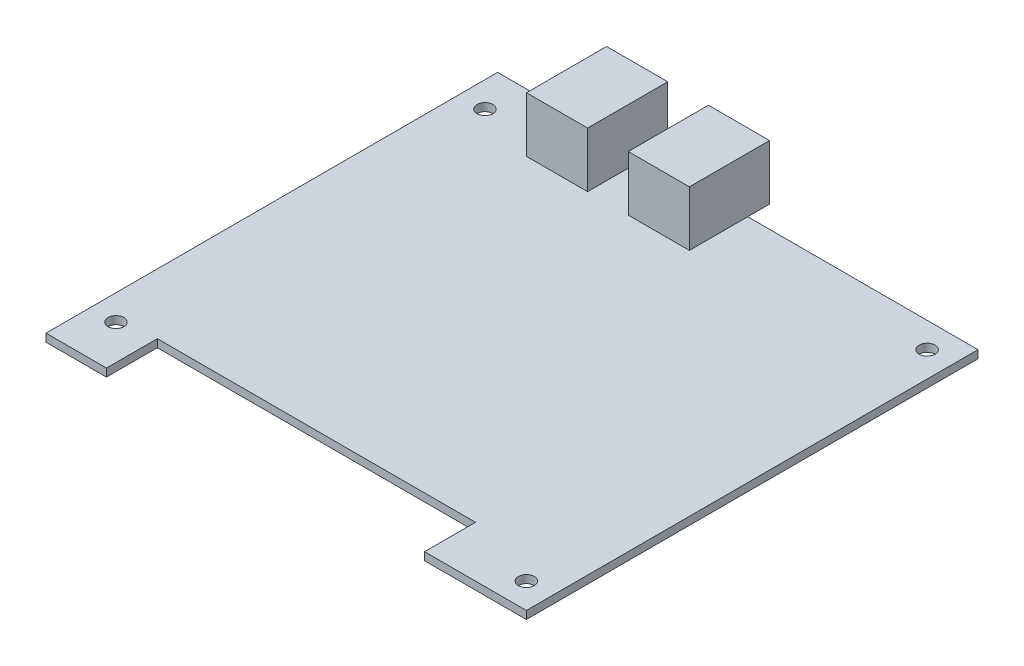
ISO-10303-21;
HEADER;
FILE_DESCRIPTION(('STEP AP214'),'2;1');
FILE_NAME('part.step','',(''),(''),'','','');
FILE_SCHEMA(('AUTOMOTIVE_DESIGN { 1 0 10303 214 1 1 1 1 }'));
ENDSEC;
DATA;
#1=APPLICATION_CONTEXT('core data for automotive mechanical design processes');
#2=APPLICATION_PROTOCOL_DEFINITION('international standard','automotive_design',2000,#1);
#3=PRODUCT_CONTEXT('',#1,'mechanical');
#4=PRODUCT('Part','Part','',(#3));
#5=PRODUCT_RELATED_PRODUCT_CATEGORY('part','',(#4));
#6=PRODUCT_DEFINITION_FORMATION('','',#4);
#7=PRODUCT_DEFINITION_CONTEXT('part definition',#1,'design');
#8=PRODUCT_DEFINITION('design','',#6,#7);
#9=PRODUCT_DEFINITION_SHAPE('','',#8);
#10=(LENGTH_UNIT() NAMED_UNIT(*) SI_UNIT(.MILLI.,.METRE.));
#11=(NAMED_UNIT(*) PLANE_ANGLE_UNIT() SI_UNIT($,.RADIAN.));
#12=(NAMED_UNIT(*) SI_UNIT($,.STERADIAN.) SOLID_ANGLE_UNIT());
#13=UNCERTAINTY_MEASURE_WITH_UNIT(LENGTH_MEASURE(1.E-05),#10,'distance_accuracy_value','');
#14=(GEOMETRIC_REPRESENTATION_CONTEXT(3) GLOBAL_UNCERTAINTY_ASSIGNED_CONTEXT((#13)) GLOBAL_UNIT_ASSIGNED_CONTEXT((#10,
#11,#12)) REPRESENTATION_CONTEXT('',''));
#15=CARTESIAN_POINT('',(0.,0.,0.));
#16=DIRECTION('',(0.,0.,1.));
#17=DIRECTION('',(1.,0.,0.));
#18=AXIS2_PLACEMENT_3D('',#15,#16,#17);
#19=CARTESIAN_POINT('',(-10.225,12.57,-49.435));
#20=DIRECTION('',(1.,0.,0.));
#21=DIRECTION('',(0.,0.,-1.));
#22=AXIS2_PLACEMENT_3D('',#19,#20,#21);
#23=PLANE('',#22);
#24=DIRECTION('',(0.,0.,1.));
#25=VECTOR('',#24,1.);
#26=CARTESIAN_POINT('',(-10.225,1.57,-49.435));
#27=LINE('',#26,#25);
#28=CARTESIAN_POINT('',(-10.225,1.57,-49.435));
#29=VERTEX_POINT('',#28);
#30=CARTESIAN_POINT('',(-10.225,1.57,-33.435));
#31=VERTEX_POINT('',#30);
#32=EDGE_CURVE('E106',#29,#31,#27,.T.);
#33=ORIENTED_EDGE('',*,*,#32,.T.);
#34=DIRECTION('',(0.,-1.,0.));
#35=VECTOR('',#34,1.);
#36=CARTESIAN_POINT('',(-10.225,12.57,-33.435));
#37=LINE('',#36,#35);
#38=CARTESIAN_POINT('',(-10.225,12.57,-33.435));
#39=VERTEX_POINT('',#38);
#40=EDGE_CURVE('E12',#39,#31,#37,.T.);
#41=ORIENTED_EDGE('',*,*,#40,.F.);
#42=DIRECTION('',(0.,0.,1.));
#43=VECTOR('',#42,1.);
#44=CARTESIAN_POINT('',(-10.225,12.57,-49.435));
#45=LINE('',#44,#43);
#46=CARTESIAN_POINT('',(-10.225,12.57,-49.435));
#47=VERTEX_POINT('',#46);
#48=EDGE_CURVE('E94',#47,#39,#45,.T.);
#49=ORIENTED_EDGE('',*,*,#48,.F.);
#50=DIRECTION('',(0.,-1.,0.));
#51=VECTOR('',#50,1.);
#52=CARTESIAN_POINT('',(-10.225,12.57,-49.435));
#53=LINE('',#52,#51);
#54=EDGE_CURVE('E102',#47,#29,#53,.T.);
#55=ORIENTED_EDGE('',*,*,#54,.T.);
#56=EDGE_LOOP('',(#33,#41,#49,#55));
#57=FACE_BOUND('',#56,.T.);
#58=ADVANCED_FACE('F43',(#57),#23,.F.);
#59=CARTESIAN_POINT('',(-10.225,12.57,-33.435));
#60=DIRECTION('',(0.,0.,-1.));
#61=DIRECTION('',(-1.,0.,0.));
#62=AXIS2_PLACEMENT_3D('',#59,#60,#61);
#63=PLANE('',#62);
#64=DIRECTION('',(1.,0.,0.));
#65=VECTOR('',#64,1.);
#66=CARTESIAN_POINT('',(-10.225,1.57,-33.435));
#67=LINE('',#66,#65);
#68=CARTESIAN_POINT('',(1.975,1.57,-33.435));
#69=VERTEX_POINT('',#68);
#70=EDGE_CURVE('E98',#31,#69,#67,.T.);
#71=ORIENTED_EDGE('',*,*,#70,.T.);
#72=DIRECTION('',(0.,-1.,0.));
#73=VECTOR('',#72,1.);
#74=CARTESIAN_POINT('',(1.975,12.57,-33.435));
#75=LINE('',#74,#73);
#76=CARTESIAN_POINT('',(1.975,12.57,-33.435));
#77=VERTEX_POINT('',#76);
#78=EDGE_CURVE('E51',#77,#69,#75,.T.);
#79=ORIENTED_EDGE('',*,*,#78,.F.);
#80=DIRECTION('',(1.,0.,0.));
#81=VECTOR('',#80,1.);
#82=CARTESIAN_POINT('',(-10.225,12.57,-33.435));
#83=LINE('',#82,#81);
#84=EDGE_CURVE('E89',#39,#77,#83,.T.);
#85=ORIENTED_EDGE('',*,*,#84,.F.);
#86=ORIENTED_EDGE('',*,*,#40,.T.);
#87=EDGE_LOOP('',(#71,#79,#85,#86));
#88=FACE_BOUND('',#87,.T.);
#89=ADVANCED_FACE('F97',(#88),#63,.F.);
#90=CARTESIAN_POINT('',(1.97499999999999,12.57,-49.435));
#91=DIRECTION('',(-1.,0.,0.));
#92=DIRECTION('',(0.,0.,1.));
#93=AXIS2_PLACEMENT_3D('',#90,#91,#92);
#94=PLANE('',#93);
#95=DIRECTION('',(0.,0.,-1.));
#96=VECTOR('',#95,1.);
#97=CARTESIAN_POINT('',(1.97499999999999,1.57,-49.435));
#98=LINE('',#97,#96);
#99=CARTESIAN_POINT('',(1.97499999999999,1.57,-49.435));
#100=VERTEX_POINT('',#99);
#101=EDGE_CURVE('E76',#69,#100,#98,.T.);
#102=ORIENTED_EDGE('',*,*,#101,.T.);
#103=DIRECTION('',(0.,-1.,0.));
#104=VECTOR('',#103,1.);
#105=CARTESIAN_POINT('',(1.97499999999999,12.57,-49.435));
#106=LINE('',#105,#104);
#107=CARTESIAN_POINT('',(1.97499999999999,12.57,-49.435));
#108=VERTEX_POINT('',#107);
#109=EDGE_CURVE('E99',#108,#100,#106,.T.);
#110=ORIENTED_EDGE('',*,*,#109,.F.);
#111=DIRECTION('',(0.,0.,-1.));
#112=VECTOR('',#111,1.);
#113=CARTESIAN_POINT('',(1.97499999999999,12.57,-49.435));
#114=LINE('',#113,#112);
#115=EDGE_CURVE('E92',#77,#108,#114,.T.);
#116=ORIENTED_EDGE('',*,*,#115,.F.);
#117=ORIENTED_EDGE('',*,*,#78,.T.);
#118=EDGE_LOOP('',(#102,#110,#116,#117));
#119=FACE_BOUND('',#118,.T.);
#120=ADVANCED_FACE('F100',(#119),#94,.F.);
#121=CARTESIAN_POINT('',(-10.225,12.57,-49.435));
#122=DIRECTION('',(0.,0.,1.));
#123=DIRECTION('',(1.,0.,0.));
#124=AXIS2_PLACEMENT_3D('',#121,#122,#123);
#125=PLANE('',#124);
#126=DIRECTION('',(-1.,0.,0.));
#127=VECTOR('',#126,1.);
#128=CARTESIAN_POINT('',(-10.225,1.57,-49.435));
#129=LINE('',#128,#127);
#130=EDGE_CURVE('E82',#100,#29,#129,.T.);
#131=ORIENTED_EDGE('',*,*,#130,.T.);
#132=ORIENTED_EDGE('',*,*,#54,.F.);
#133=DIRECTION('',(-1.,0.,0.));
#134=VECTOR('',#133,1.);
#135=CARTESIAN_POINT('',(-10.225,12.57,-49.435));
#136=LINE('',#135,#134);
#137=EDGE_CURVE('E59',#108,#47,#136,.T.);
#138=ORIENTED_EDGE('',*,*,#137,.F.);
#139=ORIENTED_EDGE('',*,*,#109,.T.);
#140=EDGE_LOOP('',(#131,#132,#138,#139));
#141=FACE_BOUND('',#140,.T.);
#142=ADVANCED_FACE('F113',(#141),#125,.F.);
#143=CARTESIAN_POINT('',(0.,12.57,0.));
#144=DIRECTION('',(0.,1.,0.));
#145=DIRECTION('',(0.,0.,1.));
#146=AXIS2_PLACEMENT_3D('',#143,#144,#145);
#147=PLANE('',#146);
#148=ORIENTED_EDGE('',*,*,#48,.T.);
#149=ORIENTED_EDGE('',*,*,#84,.T.);
#150=ORIENTED_EDGE('',*,*,#115,.T.);
#151=ORIENTED_EDGE('',*,*,#137,.T.);
#152=EDGE_LOOP('',(#148,#149,#150,#151));
#153=FACE_BOUND('',#152,.T.);
#154=ADVANCED_FACE('F90',(#153),#147,.T.);
#155=CARTESIAN_POINT('',(0.,1.57,0.));
#156=DIRECTION('',(0.,1.,0.));
#157=DIRECTION('',(0.,0.,1.));
#158=AXIS2_PLACEMENT_3D('',#155,#156,#157);
#159=PLANE('',#158);
#160=ORIENTED_EDGE('',*,*,#32,.F.);
#161=ORIENTED_EDGE('',*,*,#130,.F.);
#162=ORIENTED_EDGE('',*,*,#101,.F.);
#163=ORIENTED_EDGE('',*,*,#70,.F.);
#164=EDGE_LOOP('',(#160,#161,#162,#163));
#165=FACE_BOUND('',#164,.T.);
#166=ADVANCED_FACE('F116',(#165),#159,.F.);
#167=CLOSED_SHELL('',(#58,#89,#120,#142,#154,#166));
#168=MANIFOLD_SOLID_BREP('B2',#167);
#169=CARTESIAN_POINT('',(-30.545,12.57,-49.435));
#170=DIRECTION('',(1.,0.,0.));
#171=DIRECTION('',(0.,0.,-1.));
#172=AXIS2_PLACEMENT_3D('',#169,#170,#171);
#173=PLANE('',#172);
#174=DIRECTION('',(0.,0.,1.));
#175=VECTOR('',#174,1.);
#176=CARTESIAN_POINT('',(-30.545,1.57,-49.435));
#177=LINE('',#176,#175);
#178=CARTESIAN_POINT('',(-30.545,1.57,-49.435));
#179=VERTEX_POINT('',#178);
#180=CARTESIAN_POINT('',(-30.545,1.57,-33.435));
#181=VERTEX_POINT('',#180);
#182=EDGE_CURVE('E238',#179,#181,#177,.T.);
#183=ORIENTED_EDGE('',*,*,#182,.T.);
#184=DIRECTION('',(0.,-1.,0.));
#185=VECTOR('',#184,1.);
#186=CARTESIAN_POINT('',(-30.545,12.57,-33.435));
#187=LINE('',#186,#185);
#188=CARTESIAN_POINT('',(-30.545,12.57,-33.435));
#189=VERTEX_POINT('',#188);
#190=EDGE_CURVE('E41',#189,#181,#187,.T.);
#191=ORIENTED_EDGE('',*,*,#190,.F.);
#192=DIRECTION('',(0.,0.,1.));
#193=VECTOR('',#192,1.);
#194=CARTESIAN_POINT('',(-30.545,12.57,-49.435));
#195=LINE('',#194,#193);
#196=CARTESIAN_POINT('',(-30.545,12.57,-49.435));
#197=VERTEX_POINT('',#196);
#198=EDGE_CURVE('E226',#197,#189,#195,.T.);
#199=ORIENTED_EDGE('',*,*,#198,.F.);
#200=DIRECTION('',(0.,-1.,0.));
#201=VECTOR('',#200,1.);
#202=CARTESIAN_POINT('',(-30.545,12.57,-49.435));
#203=LINE('',#202,#201);
#204=EDGE_CURVE('E234',#197,#179,#203,.T.);
#205=ORIENTED_EDGE('',*,*,#204,.T.);
#206=EDGE_LOOP('',(#183,#191,#199,#205));
#207=FACE_BOUND('',#206,.T.);
#208=ADVANCED_FACE('F175',(#207),#173,.F.);
#209=CARTESIAN_POINT('',(-30.545,12.57,-33.435));
#210=DIRECTION('',(0.,0.,-1.));
#211=DIRECTION('',(-1.,0.,0.));
#212=AXIS2_PLACEMENT_3D('',#209,#210,#211);
#213=PLANE('',#212);
#214=DIRECTION('',(1.,0.,0.));
#215=VECTOR('',#214,1.);
#216=CARTESIAN_POINT('',(-30.545,1.57,-33.435));
#217=LINE('',#216,#215);
#218=CARTESIAN_POINT('',(-18.345,1.57,-33.435));
#219=VERTEX_POINT('',#218);
#220=EDGE_CURVE('E230',#181,#219,#217,.T.);
#221=ORIENTED_EDGE('',*,*,#220,.T.);
#222=DIRECTION('',(0.,-1.,0.));
#223=VECTOR('',#222,1.);
#224=CARTESIAN_POINT('',(-18.345,12.57,-33.435));
#225=LINE('',#224,#223);
#226=CARTESIAN_POINT('',(-18.345,12.57,-33.435));
#227=VERTEX_POINT('',#226);
#228=EDGE_CURVE('E183',#227,#219,#225,.T.);
#229=ORIENTED_EDGE('',*,*,#228,.F.);
#230=DIRECTION('',(1.,0.,0.));
#231=VECTOR('',#230,1.);
#232=CARTESIAN_POINT('',(-30.545,12.57,-33.435));
#233=LINE('',#232,#231);
#234=EDGE_CURVE('E221',#189,#227,#233,.T.);
#235=ORIENTED_EDGE('',*,*,#234,.F.);
#236=ORIENTED_EDGE('',*,*,#190,.T.);
#237=EDGE_LOOP('',(#221,#229,#235,#236));
#238=FACE_BOUND('',#237,.T.);
#239=ADVANCED_FACE('F229',(#238),#213,.F.);
#240=CARTESIAN_POINT('',(-18.345,12.57,-49.435));
#241=DIRECTION('',(-1.,0.,0.));
#242=DIRECTION('',(0.,0.,1.));
#243=AXIS2_PLACEMENT_3D('',#240,#241,#242);
#244=PLANE('',#243);
#245=DIRECTION('',(0.,0.,-1.));
#246=VECTOR('',#245,1.);
#247=CARTESIAN_POINT('',(-18.345,1.57,-49.435));
#248=LINE('',#247,#246);
#249=CARTESIAN_POINT('',(-18.345,1.57,-49.435));
#250=VERTEX_POINT('',#249);
#251=EDGE_CURVE('E208',#219,#250,#248,.T.);
#252=ORIENTED_EDGE('',*,*,#251,.T.);
#253=DIRECTION('',(0.,-1.,0.));
#254=VECTOR('',#253,1.);
#255=CARTESIAN_POINT('',(-18.345,12.57,-49.435));
#256=LINE('',#255,#254);
#257=CARTESIAN_POINT('',(-18.345,12.57,-49.435));
#258=VERTEX_POINT('',#257);
#259=EDGE_CURVE('E231',#258,#250,#256,.T.);
#260=ORIENTED_EDGE('',*,*,#259,.F.);
#261=DIRECTION('',(0.,0.,-1.));
#262=VECTOR('',#261,1.);
#263=CARTESIAN_POINT('',(-18.345,12.57,-49.435));
#264=LINE('',#263,#262);
#265=EDGE_CURVE('E224',#227,#258,#264,.T.);
#266=ORIENTED_EDGE('',*,*,#265,.F.);
#267=ORIENTED_EDGE('',*,*,#228,.T.);
#268=EDGE_LOOP('',(#252,#260,#266,#267));
#269=FACE_BOUND('',#268,.T.);
#270=ADVANCED_FACE('F232',(#269),#244,.F.);
#271=CARTESIAN_POINT('',(-30.545,12.57,-49.435));
#272=DIRECTION('',(0.,0.,1.));
#273=DIRECTION('',(1.,0.,0.));
#274=AXIS2_PLACEMENT_3D('',#271,#272,#273);
#275=PLANE('',#274);
#276=DIRECTION('',(-1.,0.,0.));
#277=VECTOR('',#276,1.);
#278=CARTESIAN_POINT('',(-30.545,1.57,-49.435));
#279=LINE('',#278,#277);
#280=EDGE_CURVE('E214',#250,#179,#279,.T.);
#281=ORIENTED_EDGE('',*,*,#280,.T.);
#282=ORIENTED_EDGE('',*,*,#204,.F.);
#283=DIRECTION('',(-1.,0.,0.));
#284=VECTOR('',#283,1.);
#285=CARTESIAN_POINT('',(-30.545,12.57,-49.435));
#286=LINE('',#285,#284);
#287=EDGE_CURVE('E191',#258,#197,#286,.T.);
#288=ORIENTED_EDGE('',*,*,#287,.F.);
#289=ORIENTED_EDGE('',*,*,#259,.T.);
#290=EDGE_LOOP('',(#281,#282,#288,#289));
#291=FACE_BOUND('',#290,.T.);
#292=ADVANCED_FACE('F245',(#291),#275,.F.);
#293=CARTESIAN_POINT('',(0.,12.57,0.));
#294=DIRECTION('',(0.,1.,0.));
#295=DIRECTION('',(0.,0.,1.));
#296=AXIS2_PLACEMENT_3D('',#293,#294,#295);
#297=PLANE('',#296);
#298=ORIENTED_EDGE('',*,*,#198,.T.);
#299=ORIENTED_EDGE('',*,*,#234,.T.);
#300=ORIENTED_EDGE('',*,*,#265,.T.);
#301=ORIENTED_EDGE('',*,*,#287,.T.);
#302=EDGE_LOOP('',(#298,#299,#300,#301));
#303=FACE_BOUND('',#302,.T.);
#304=ADVANCED_FACE('F222',(#303),#297,.T.);
#305=CARTESIAN_POINT('',(0.,1.57,0.));
#306=DIRECTION('',(0.,1.,0.));
#307=DIRECTION('',(0.,0.,1.));
#308=AXIS2_PLACEMENT_3D('',#305,#306,#307);
#309=PLANE('',#308);
#310=ORIENTED_EDGE('',*,*,#182,.F.);
#311=ORIENTED_EDGE('',*,*,#280,.F.);
#312=ORIENTED_EDGE('',*,*,#251,.F.);
#313=ORIENTED_EDGE('',*,*,#220,.F.);
#314=EDGE_LOOP('',(#310,#311,#312,#313));
#315=FACE_BOUND('',#314,.T.);
#316=ADVANCED_FACE('F248',(#315),#309,.F.);
#317=CLOSED_SHELL('',(#208,#239,#270,#292,#304,#316));
#318=MANIFOLD_SOLID_BREP('B6',#317);
#319=CARTESIAN_POINT('',(-47.945,1.57,45.085));
#320=DIRECTION('',(1.,0.,0.));
#321=DIRECTION('',(0.,0.,-1.));
#322=AXIS2_PLACEMENT_3D('',#319,#320,#321);
#323=PLANE('',#322);
#324=DIRECTION('',(0.,0.,1.));
#325=VECTOR('',#324,1.);
#326=CARTESIAN_POINT('',(-47.945,0.,45.085));
#327=LINE('',#326,#325);
#328=CARTESIAN_POINT('',(-47.945,0.,-45.085));
#329=VERTEX_POINT('',#328);
#330=CARTESIAN_POINT('',(-47.945,0.,45.085));
#331=VERTEX_POINT('',#330);
#332=EDGE_CURVE('E394',#329,#331,#327,.T.);
#333=ORIENTED_EDGE('',*,*,#332,.T.);
#334=DIRECTION('',(0.,-1.,0.));
#335=VECTOR('',#334,1.);
#336=CARTESIAN_POINT('',(-47.945,1.57,45.085));
#337=LINE('',#336,#335);
#338=CARTESIAN_POINT('',(-47.945,1.57,45.085));
#339=VERTEX_POINT('',#338);
#340=EDGE_CURVE('E173',#339,#331,#337,.T.);
#341=ORIENTED_EDGE('',*,*,#340,.F.);
#342=DIRECTION('',(0.,0.,1.));
#343=VECTOR('',#342,1.);
#344=CARTESIAN_POINT('',(-47.945,1.57,45.085));
#345=LINE('',#344,#343);
#346=CARTESIAN_POINT('',(-47.945,1.57,-45.085));
#347=VERTEX_POINT('',#346);
#348=EDGE_CURVE('E409',#347,#339,#345,.T.);
#349=ORIENTED_EDGE('',*,*,#348,.F.);
#350=DIRECTION('',(0.,-1.,0.));
#351=VECTOR('',#350,1.);
#352=CARTESIAN_POINT('',(-47.945,1.57,-45.085));
#353=LINE('',#352,#351);
#354=EDGE_CURVE('E390',#347,#329,#353,.T.);
#355=ORIENTED_EDGE('',*,*,#354,.T.);
#356=EDGE_LOOP('',(#333,#341,#349,#355));
#357=FACE_BOUND('',#356,.T.);
#358=ADVANCED_FACE('F298',(#357),#323,.F.);
#359=CARTESIAN_POINT('',(-35.875,1.57,45.085));
#360=DIRECTION('',(0.,0.,-1.));
#361=DIRECTION('',(-1.,0.,0.));
#362=AXIS2_PLACEMENT_3D('',#359,#360,#361);
#363=PLANE('',#362);
#364=DIRECTION('',(1.,0.,0.));
#365=VECTOR('',#364,1.);
#366=CARTESIAN_POINT('',(-35.875,0.,45.085));
#367=LINE('',#366,#365);
#368=CARTESIAN_POINT('',(-35.875,0.,45.085));
#369=VERTEX_POINT('',#368);
#370=EDGE_CURVE('E397',#331,#369,#367,.T.);
#371=ORIENTED_EDGE('',*,*,#370,.T.);
#372=DIRECTION('',(0.,-1.,0.));
#373=VECTOR('',#372,1.);
#374=CARTESIAN_POINT('',(-35.875,1.57,45.085));
#375=LINE('',#374,#373);
#376=CARTESIAN_POINT('',(-35.875,1.57,45.085));
#377=VERTEX_POINT('',#376);
#378=EDGE_CURVE('E306',#377,#369,#375,.T.);
#379=ORIENTED_EDGE('',*,*,#378,.F.);
#380=DIRECTION('',(1.,0.,0.));
#381=VECTOR('',#380,1.);
#382=CARTESIAN_POINT('',(-35.875,1.57,45.085));
#383=LINE('',#382,#381);
#384=EDGE_CURVE('E357',#339,#377,#383,.T.);
#385=ORIENTED_EDGE('',*,*,#384,.F.);
#386=ORIENTED_EDGE('',*,*,#340,.T.);
#387=EDGE_LOOP('',(#371,#379,#385,#386));
#388=FACE_BOUND('',#387,.T.);
#389=ADVANCED_FACE('F499',(#388),#363,.F.);
#390=CARTESIAN_POINT('',(-35.875,1.57,45.085));
#391=DIRECTION('',(-1.,0.,0.));
#392=DIRECTION('',(0.,0.,1.));
#393=AXIS2_PLACEMENT_3D('',#390,#391,#392);
#394=PLANE('',#393);
#395=DIRECTION('',(0.,0.,-1.));
#396=VECTOR('',#395,1.);
#397=CARTESIAN_POINT('',(-35.875,0.,45.085));
#398=LINE('',#397,#396);
#399=CARTESIAN_POINT('',(-35.875,0.,34.925));
#400=VERTEX_POINT('',#399);
#401=EDGE_CURVE('E400',#369,#400,#398,.T.);
#402=ORIENTED_EDGE('',*,*,#401,.T.);
#403=DIRECTION('',(0.,-1.,0.));
#404=VECTOR('',#403,1.);
#405=CARTESIAN_POINT('',(-35.875,1.57,34.925));
#406=LINE('',#405,#404);
#407=CARTESIAN_POINT('',(-35.875,1.57,34.925));
#408=VERTEX_POINT('',#407);
#409=EDGE_CURVE('E416',#408,#400,#406,.T.);
#410=ORIENTED_EDGE('',*,*,#409,.F.);
#411=DIRECTION('',(0.,0.,-1.));
#412=VECTOR('',#411,1.);
#413=CARTESIAN_POINT('',(-35.875,1.57,45.085));
#414=LINE('',#413,#412);
#415=EDGE_CURVE('E424',#377,#408,#414,.T.);
#416=ORIENTED_EDGE('',*,*,#415,.F.);
#417=ORIENTED_EDGE('',*,*,#378,.T.);
#418=EDGE_LOOP('',(#402,#410,#416,#417));
#419=FACE_BOUND('',#418,.T.);
#420=ADVANCED_FACE('F422',(#419),#394,.F.);
#421=CARTESIAN_POINT('',(-35.875,1.57,34.925));
#422=DIRECTION('',(0.,0.,-1.));
#423=DIRECTION('',(-1.,0.,0.));
#424=AXIS2_PLACEMENT_3D('',#421,#422,#423);
#425=PLANE('',#424);
#426=DIRECTION('',(1.,0.,0.));
#427=VECTOR('',#426,1.);
#428=CARTESIAN_POINT('',(-35.875,0.,34.925));
#429=LINE('',#428,#427);
#430=CARTESIAN_POINT('',(27.625,0.,34.925));
#431=VERTEX_POINT('',#430);
#432=EDGE_CURVE('E402',#400,#431,#429,.T.);
#433=ORIENTED_EDGE('',*,*,#432,.T.);
#434=DIRECTION('',(0.,-1.,0.));
#435=VECTOR('',#434,1.);
#436=CARTESIAN_POINT('',(27.625,1.57,34.925));
#437=LINE('',#436,#435);
#438=CARTESIAN_POINT('',(27.625,1.57,34.925));
#439=VERTEX_POINT('',#438);
#440=EDGE_CURVE('E413',#439,#431,#437,.T.);
#441=ORIENTED_EDGE('',*,*,#440,.F.);
#442=DIRECTION('',(1.,0.,0.));
#443=VECTOR('',#442,1.);
#444=CARTESIAN_POINT('',(-35.875,1.57,34.925));
#445=LINE('',#444,#443);
#446=EDGE_CURVE('E436',#408,#439,#445,.T.);
#447=ORIENTED_EDGE('',*,*,#446,.F.);
#448=ORIENTED_EDGE('',*,*,#409,.T.);
#449=EDGE_LOOP('',(#433,#441,#447,#448));
#450=FACE_BOUND('',#449,.T.);
#451=ADVANCED_FACE('F432',(#450),#425,.F.);
#452=CARTESIAN_POINT('',(27.625,1.57,45.085));
#453=DIRECTION('',(1.,0.,0.));
#454=DIRECTION('',(0.,0.,-1.));
#455=AXIS2_PLACEMENT_3D('',#452,#453,#454);
#456=PLANE('',#455);
#457=DIRECTION('',(0.,0.,1.));
#458=VECTOR('',#457,1.);
#459=CARTESIAN_POINT('',(27.625,0.,45.085));
#460=LINE('',#459,#458);
#461=CARTESIAN_POINT('',(27.625,0.,45.085));
#462=VERTEX_POINT('',#461);
#463=EDGE_CURVE('E404',#431,#462,#460,.T.);
#464=ORIENTED_EDGE('',*,*,#463,.T.);
#465=DIRECTION('',(0.,-1.,0.));
#466=VECTOR('',#465,1.);
#467=CARTESIAN_POINT('',(27.625,1.57,45.085));
#468=LINE('',#467,#466);
#469=CARTESIAN_POINT('',(27.625,1.57,45.085));
#470=VERTEX_POINT('',#469);
#471=EDGE_CURVE('E385',#470,#462,#468,.T.);
#472=ORIENTED_EDGE('',*,*,#471,.F.);
#473=DIRECTION('',(0.,0.,1.));
#474=VECTOR('',#473,1.);
#475=CARTESIAN_POINT('',(27.625,1.57,45.085));
#476=LINE('',#475,#474);
#477=EDGE_CURVE('E376',#439,#470,#476,.T.);
#478=ORIENTED_EDGE('',*,*,#477,.F.);
#479=ORIENTED_EDGE('',*,*,#440,.T.);
#480=EDGE_LOOP('',(#464,#472,#478,#479));
#481=FACE_BOUND('',#480,.T.);
#482=ADVANCED_FACE('F435',(#481),#456,.F.);
#483=CARTESIAN_POINT('',(47.945,1.57,45.085));
#484=DIRECTION('',(0.,0.,-1.));
#485=DIRECTION('',(-1.,0.,0.));
#486=AXIS2_PLACEMENT_3D('',#483,#484,#485);
#487=PLANE('',#486);
#488=DIRECTION('',(1.,0.,0.));
#489=VECTOR('',#488,1.);
#490=CARTESIAN_POINT('',(47.945,0.,45.085));
#491=LINE('',#490,#489);
#492=CARTESIAN_POINT('',(47.945,0.,45.085));
#493=VERTEX_POINT('',#492);
#494=EDGE_CURVE('E384',#462,#493,#491,.T.);
#495=ORIENTED_EDGE('',*,*,#494,.T.);
#496=DIRECTION('',(0.,-1.,0.));
#497=VECTOR('',#496,1.);
#498=CARTESIAN_POINT('',(47.945,1.57,45.085));
#499=LINE('',#498,#497);
#500=CARTESIAN_POINT('',(47.945,1.57,45.085));
#501=VERTEX_POINT('',#500);
#502=EDGE_CURVE('E381',#501,#493,#499,.T.);
#503=ORIENTED_EDGE('',*,*,#502,.F.);
#504=DIRECTION('',(1.,0.,0.));
#505=VECTOR('',#504,1.);
#506=CARTESIAN_POINT('',(47.945,1.57,45.085));
#507=LINE('',#506,#505);
#508=EDGE_CURVE('E370',#470,#501,#507,.T.);
#509=ORIENTED_EDGE('',*,*,#508,.F.);
#510=ORIENTED_EDGE('',*,*,#471,.T.);
#511=EDGE_LOOP('',(#495,#503,#509,#510));
#512=FACE_BOUND('',#511,.T.);
#513=ADVANCED_FACE('F382',(#512),#487,.F.);
#514=CARTESIAN_POINT('',(47.945,1.57,45.085));
#515=DIRECTION('',(-1.,0.,0.));
#516=DIRECTION('',(0.,0.,1.));
#517=AXIS2_PLACEMENT_3D('',#514,#515,#516);
#518=PLANE('',#517);
#519=DIRECTION('',(0.,0.,-1.));
#520=VECTOR('',#519,1.);
#521=CARTESIAN_POINT('',(47.945,0.,45.085));
#522=LINE('',#521,#520);
#523=CARTESIAN_POINT('',(47.945,0.,-45.085));
#524=VERTEX_POINT('',#523);
#525=EDGE_CURVE('E343',#493,#524,#522,.T.);
#526=ORIENTED_EDGE('',*,*,#525,.T.);
#527=DIRECTION('',(0.,-1.,0.));
#528=VECTOR('',#527,1.);
#529=CARTESIAN_POINT('',(47.945,1.57,-45.085));
#530=LINE('',#529,#528);
#531=CARTESIAN_POINT('',(47.945,1.57,-45.085));
#532=VERTEX_POINT('',#531);
#533=EDGE_CURVE('E386',#532,#524,#530,.T.);
#534=ORIENTED_EDGE('',*,*,#533,.F.);
#535=DIRECTION('',(0.,0.,-1.));
#536=VECTOR('',#535,1.);
#537=CARTESIAN_POINT('',(47.945,1.57,45.085));
#538=LINE('',#537,#536);
#539=EDGE_CURVE('E374',#501,#532,#538,.T.);
#540=ORIENTED_EDGE('',*,*,#539,.F.);
#541=ORIENTED_EDGE('',*,*,#502,.T.);
#542=EDGE_LOOP('',(#526,#534,#540,#541));
#543=FACE_BOUND('',#542,.T.);
#544=ADVANCED_FACE('F388',(#543),#518,.F.);
#545=CARTESIAN_POINT('',(47.945,1.57,-45.085));
#546=DIRECTION('',(0.,0.,1.));
#547=DIRECTION('',(1.,0.,0.));
#548=AXIS2_PLACEMENT_3D('',#545,#546,#547);
#549=PLANE('',#548);
#550=DIRECTION('',(-1.,0.,0.));
#551=VECTOR('',#550,1.);
#552=CARTESIAN_POINT('',(47.945,0.,-45.085));
#553=LINE('',#552,#551);
#554=EDGE_CURVE('E349',#524,#329,#553,.T.);
#555=ORIENTED_EDGE('',*,*,#554,.T.);
#556=ORIENTED_EDGE('',*,*,#354,.F.);
#557=DIRECTION('',(-1.,0.,0.));
#558=VECTOR('',#557,1.);
#559=CARTESIAN_POINT('',(47.945,1.57,-45.085));
#560=LINE('',#559,#558);
#561=EDGE_CURVE('E314',#532,#347,#560,.T.);
#562=ORIENTED_EDGE('',*,*,#561,.F.);
#563=ORIENTED_EDGE('',*,*,#533,.T.);
#564=EDGE_LOOP('',(#555,#556,#562,#563));
#565=FACE_BOUND('',#564,.T.);
#566=ADVANCED_FACE('F477',(#565),#549,.F.);
#567=CARTESIAN_POINT('',(0.,1.57,0.));
#568=DIRECTION('',(0.,1.,0.));
#569=DIRECTION('',(0.,0.,1.));
#570=AXIS2_PLACEMENT_3D('',#567,#568,#569);
#571=PLANE('',#570);
#572=CARTESIAN_POINT('',(42.865,1.57,-40.005));
#573=DIRECTION('',(0.,1.,0.));
#574=DIRECTION('',(0.,0.,1.));
#575=AXIS2_PLACEMENT_3D('',#572,#573,#574);
#576=CIRCLE('',#575,1.59);
#577=CARTESIAN_POINT('',(42.865,1.57,-38.415));
#578=VERTEX_POINT('',#577);
#579=EDGE_CURVE('E460',#578,#578,#576,.T.);
#580=ORIENTED_EDGE('',*,*,#579,.F.);
#581=EDGE_LOOP('',(#580));
#582=FACE_BOUND('',#581,.T.);
#583=CARTESIAN_POINT('',(-42.865,1.57,-37.465));
#584=DIRECTION('',(0.,1.,0.));
#585=DIRECTION('',(0.,0.,1.));
#586=AXIS2_PLACEMENT_3D('',#583,#584,#585);
#587=CIRCLE('',#586,1.59);
#588=CARTESIAN_POINT('',(-42.865,1.57,-35.875));
#589=VERTEX_POINT('',#588);
#590=EDGE_CURVE('E454',#589,#589,#587,.T.);
#591=ORIENTED_EDGE('',*,*,#590,.F.);
#592=EDGE_LOOP('',(#591));
#593=FACE_BOUND('',#592,.T.);
#594=CARTESIAN_POINT('',(-42.865,1.57,36.195));
#595=DIRECTION('',(0.,1.,0.));
#596=DIRECTION('',(0.,0.,1.));
#597=AXIS2_PLACEMENT_3D('',#594,#595,#596);
#598=CIRCLE('',#597,1.59);
#599=CARTESIAN_POINT('',(-42.865,1.57,37.785));
#600=VERTEX_POINT('',#599);
#601=EDGE_CURVE('E448',#600,#600,#598,.T.);
#602=ORIENTED_EDGE('',*,*,#601,.F.);
#603=EDGE_LOOP('',(#602));
#604=FACE_BOUND('',#603,.T.);
#605=CARTESIAN_POINT('',(42.865,1.57,40.005));
#606=DIRECTION('',(0.,1.,0.));
#607=DIRECTION('',(0.,0.,1.));
#608=AXIS2_PLACEMENT_3D('',#605,#606,#607);
#609=CIRCLE('',#608,1.59);
#610=CARTESIAN_POINT('',(42.865,1.57,41.595));
#611=VERTEX_POINT('',#610);
#612=EDGE_CURVE('E442',#611,#611,#609,.T.);
#613=ORIENTED_EDGE('',*,*,#612,.F.);
#614=EDGE_LOOP('',(#613));
#615=FACE_BOUND('',#614,.T.);
#616=ORIENTED_EDGE('',*,*,#348,.T.);
#617=ORIENTED_EDGE('',*,*,#384,.T.);
#618=ORIENTED_EDGE('',*,*,#415,.T.);
#619=ORIENTED_EDGE('',*,*,#446,.T.);
#620=ORIENTED_EDGE('',*,*,#477,.T.);
#621=ORIENTED_EDGE('',*,*,#508,.T.);
#622=ORIENTED_EDGE('',*,*,#539,.T.);
#623=ORIENTED_EDGE('',*,*,#561,.T.);
#624=EDGE_LOOP('',(#616,#617,#618,#619,#620,#621,#622,#623));
#625=FACE_BOUND('',#624,.T.);
#626=ADVANCED_FACE('F372',(#582,#593,#604,#615,#625),#571,.T.);
#627=CARTESIAN_POINT('',(0.,0.,0.));
#628=DIRECTION('',(0.,1.,0.));
#629=DIRECTION('',(0.,0.,1.));
#630=AXIS2_PLACEMENT_3D('',#627,#628,#629);
#631=PLANE('',#630);
#632=CARTESIAN_POINT('',(42.865,0.,-40.005));
#633=DIRECTION('',(0.,1.,0.));
#634=DIRECTION('',(0.,0.,1.));
#635=AXIS2_PLACEMENT_3D('',#632,#633,#634);
#636=CIRCLE('',#635,1.59);
#637=CARTESIAN_POINT('',(42.865,0.,-38.415));
#638=VERTEX_POINT('',#637);
#639=EDGE_CURVE('E457',#638,#638,#636,.T.);
#640=ORIENTED_EDGE('',*,*,#639,.T.);
#641=EDGE_LOOP('',(#640));
#642=FACE_BOUND('',#641,.T.);
#643=CARTESIAN_POINT('',(-42.865,0.,-37.465));
#644=DIRECTION('',(0.,1.,0.));
#645=DIRECTION('',(0.,0.,1.));
#646=AXIS2_PLACEMENT_3D('',#643,#644,#645);
#647=CIRCLE('',#646,1.59);
#648=CARTESIAN_POINT('',(-42.865,0.,-35.875));
#649=VERTEX_POINT('',#648);
#650=EDGE_CURVE('E451',#649,#649,#647,.T.);
#651=ORIENTED_EDGE('',*,*,#650,.T.);
#652=EDGE_LOOP('',(#651));
#653=FACE_BOUND('',#652,.T.);
#654=CARTESIAN_POINT('',(-42.865,0.,36.195));
#655=DIRECTION('',(0.,1.,0.));
#656=DIRECTION('',(0.,0.,1.));
#657=AXIS2_PLACEMENT_3D('',#654,#655,#656);
#658=CIRCLE('',#657,1.59);
#659=CARTESIAN_POINT('',(-42.865,0.,37.785));
#660=VERTEX_POINT('',#659);
#661=EDGE_CURVE('E445',#660,#660,#658,.T.);
#662=ORIENTED_EDGE('',*,*,#661,.T.);
#663=EDGE_LOOP('',(#662));
#664=FACE_BOUND('',#663,.T.);
#665=CARTESIAN_POINT('',(42.865,0.,40.005));
#666=DIRECTION('',(0.,1.,0.));
#667=DIRECTION('',(0.,0.,1.));
#668=AXIS2_PLACEMENT_3D('',#665,#666,#667);
#669=CIRCLE('',#668,1.59);
#670=CARTESIAN_POINT('',(42.865,0.,41.595));
#671=VERTEX_POINT('',#670);
#672=EDGE_CURVE('E398',#671,#671,#669,.T.);
#673=ORIENTED_EDGE('',*,*,#672,.T.);
#674=EDGE_LOOP('',(#673));
#675=FACE_BOUND('',#674,.T.);
#676=ORIENTED_EDGE('',*,*,#332,.F.);
#677=ORIENTED_EDGE('',*,*,#554,.F.);
#678=ORIENTED_EDGE('',*,*,#525,.F.);
#679=ORIENTED_EDGE('',*,*,#494,.F.);
#680=ORIENTED_EDGE('',*,*,#463,.F.);
#681=ORIENTED_EDGE('',*,*,#432,.F.);
#682=ORIENTED_EDGE('',*,*,#401,.F.);
#683=ORIENTED_EDGE('',*,*,#370,.F.);
#684=EDGE_LOOP('',(#676,#677,#678,#679,#680,#681,#682,#683));
#685=FACE_BOUND('',#684,.T.);
#686=ADVANCED_FACE('F428',(#642,#653,#664,#675,#685),#631,.F.);
#687=CARTESIAN_POINT('',(42.865,0.,40.005));
#688=DIRECTION('',(0.,1.,0.));
#689=DIRECTION('',(0.,0.,1.));
#690=AXIS2_PLACEMENT_3D('',#687,#688,#689);
#691=CYLINDRICAL_SURFACE('',#690,1.59);
#692=ORIENTED_EDGE('',*,*,#672,.F.);
#693=EDGE_LOOP('',(#692));
#694=FACE_BOUND('',#693,.T.);
#695=ORIENTED_EDGE('',*,*,#612,.T.);
#696=EDGE_LOOP('',(#695));
#697=FACE_BOUND('',#696,.T.);
#698=ADVANCED_FACE('F485',(#694,#697),#691,.F.);
#699=CARTESIAN_POINT('',(-42.865,0.,36.195));
#700=DIRECTION('',(0.,1.,0.));
#701=DIRECTION('',(0.,0.,1.));
#702=AXIS2_PLACEMENT_3D('',#699,#700,#701);
#703=CYLINDRICAL_SURFACE('',#702,1.59);
#704=ORIENTED_EDGE('',*,*,#661,.F.);
#705=EDGE_LOOP('',(#704));
#706=FACE_BOUND('',#705,.T.);
#707=ORIENTED_EDGE('',*,*,#601,.T.);
#708=EDGE_LOOP('',(#707));
#709=FACE_BOUND('',#708,.T.);
#710=ADVANCED_FACE('F487',(#706,#709),#703,.F.);
#711=CARTESIAN_POINT('',(-42.865,0.,-37.465));
#712=DIRECTION('',(0.,1.,0.));
#713=DIRECTION('',(0.,0.,1.));
#714=AXIS2_PLACEMENT_3D('',#711,#712,#713);
#715=CYLINDRICAL_SURFACE('',#714,1.59);
#716=ORIENTED_EDGE('',*,*,#650,.F.);
#717=EDGE_LOOP('',(#716));
#718=FACE_BOUND('',#717,.T.);
#719=ORIENTED_EDGE('',*,*,#590,.T.);
#720=EDGE_LOOP('',(#719));
#721=FACE_BOUND('',#720,.T.);
#722=ADVANCED_FACE('F471',(#718,#721),#715,.F.);
#723=CARTESIAN_POINT('',(42.865,0.,-40.005));
#724=DIRECTION('',(0.,1.,0.));
#725=DIRECTION('',(0.,0.,1.));
#726=AXIS2_PLACEMENT_3D('',#723,#724,#725);
#727=CYLINDRICAL_SURFACE('',#726,1.59);
#728=ORIENTED_EDGE('',*,*,#639,.F.);
#729=EDGE_LOOP('',(#728));
#730=FACE_BOUND('',#729,.T.);
#731=ORIENTED_EDGE('',*,*,#579,.T.);
#732=EDGE_LOOP('',(#731));
#733=FACE_BOUND('',#732,.T.);
#734=ADVANCED_FACE('F468',(#730,#733),#727,.F.);
#735=CLOSED_SHELL('',(#358,#389,#420,#451,#482,#513,#544,#566,#626,#686,#698,#710,#722,#734));
#736=MANIFOLD_SOLID_BREP('B35',#735);
#737=ADVANCED_BREP_SHAPE_REPRESENTATION('',(#18,#168,#318,#736),#14);
#738=SHAPE_DEFINITION_REPRESENTATION(#9,#737);
ENDSEC;
END-ISO-10303-21;
